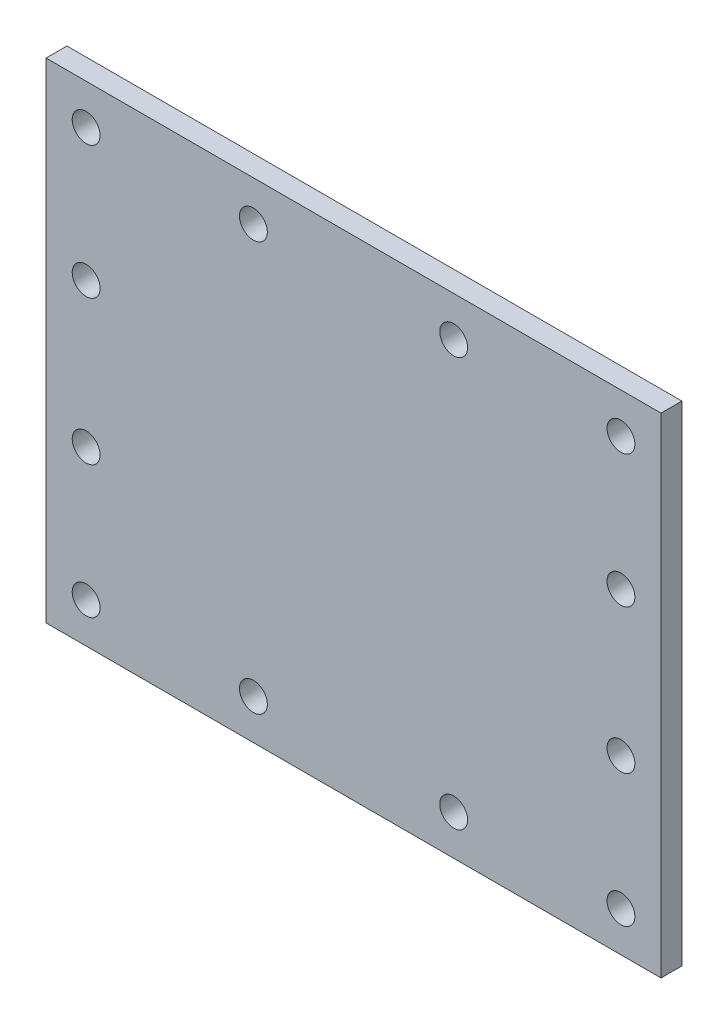
ISO-10303-21;
HEADER;
FILE_DESCRIPTION(('STEP AP214'),'2;1');
FILE_NAME('part.step','',(''),(''),'','','');
FILE_SCHEMA(('AUTOMOTIVE_DESIGN { 1 0 10303 214 1 1 1 1 }'));
ENDSEC;
DATA;
#1=APPLICATION_CONTEXT('core data for automotive mechanical design processes');
#2=APPLICATION_PROTOCOL_DEFINITION('international standard','automotive_design',2000,#1);
#3=PRODUCT_CONTEXT('',#1,'mechanical');
#4=PRODUCT('Part','Part','',(#3));
#5=PRODUCT_RELATED_PRODUCT_CATEGORY('part','',(#4));
#6=PRODUCT_DEFINITION_FORMATION('','',#4);
#7=PRODUCT_DEFINITION_CONTEXT('part definition',#1,'design');
#8=PRODUCT_DEFINITION('design','',#6,#7);
#9=PRODUCT_DEFINITION_SHAPE('','',#8);
#10=(LENGTH_UNIT() NAMED_UNIT(*) SI_UNIT(.MILLI.,.METRE.));
#11=(NAMED_UNIT(*) PLANE_ANGLE_UNIT() SI_UNIT($,.RADIAN.));
#12=(NAMED_UNIT(*) SI_UNIT($,.STERADIAN.) SOLID_ANGLE_UNIT());
#13=UNCERTAINTY_MEASURE_WITH_UNIT(LENGTH_MEASURE(1.E-05),#10,'distance_accuracy_value','');
#14=(GEOMETRIC_REPRESENTATION_CONTEXT(3) GLOBAL_UNCERTAINTY_ASSIGNED_CONTEXT((#13)) GLOBAL_UNIT_ASSIGNED_CONTEXT((#10,
#11,#12)) REPRESENTATION_CONTEXT('',''));
#15=CARTESIAN_POINT('',(0.,0.,0.));
#16=DIRECTION('',(0.,0.,1.));
#17=DIRECTION('',(1.,0.,0.));
#18=AXIS2_PLACEMENT_3D('',#15,#16,#17);
#19=CARTESIAN_POINT('',(-146.014312824647,106.091954424767,-2.51040500289528));
#20=DIRECTION('',(0.,1.,0.));
#21=DIRECTION('',(-1.,0.,0.));
#22=AXIS2_PLACEMENT_3D('',#19,#20,#21);
#23=PLANE('',#22);
#24=DIRECTION('',(1.,0.,0.));
#25=VECTOR('',#24,1.);
#26=CARTESIAN_POINT('',(-146.014312824647,106.091954424767,-5.51040500289528));
#27=LINE('',#26,#25);
#28=CARTESIAN_POINT('',(-146.014312824647,106.091954424767,-5.51040500289528));
#29=VERTEX_POINT('',#28);
#30=CARTESIAN_POINT('',(-57.7743128246472,106.091954424767,-5.51040500289528));
#31=VERTEX_POINT('',#30);
#32=EDGE_CURVE('E98',#29,#31,#27,.T.);
#33=ORIENTED_EDGE('',*,*,#32,.F.);
#34=DIRECTION('',(0.,0.,-1.));
#35=VECTOR('',#34,1.);
#36=CARTESIAN_POINT('',(-146.014312824647,106.091954424767,-2.51040500289528));
#37=LINE('',#36,#35);
#38=CARTESIAN_POINT('',(-146.014312824647,106.091954424767,-2.51040500289528));
#39=VERTEX_POINT('',#38);
#40=EDGE_CURVE('E11',#39,#29,#37,.T.);
#41=ORIENTED_EDGE('',*,*,#40,.F.);
#42=DIRECTION('',(1.,0.,0.));
#43=VECTOR('',#42,1.);
#44=CARTESIAN_POINT('',(-146.014312824647,106.091954424767,-2.51040500289528));
#45=LINE('',#44,#43);
#46=CARTESIAN_POINT('',(-57.7743128246472,106.091954424767,-2.51040500289528));
#47=VERTEX_POINT('',#46);
#48=EDGE_CURVE('E91',#39,#47,#45,.T.);
#49=ORIENTED_EDGE('',*,*,#48,.T.);
#50=DIRECTION('',(0.,0.,-1.));
#51=VECTOR('',#50,1.);
#52=CARTESIAN_POINT('',(-57.7743128246472,106.091954424767,-2.51040500289528));
#53=LINE('',#52,#51);
#54=EDGE_CURVE('E36',#47,#31,#53,.T.);
#55=ORIENTED_EDGE('',*,*,#54,.T.);
#56=EDGE_LOOP('',(#33,#41,#49,#55));
#57=FACE_BOUND('',#56,.T.);
#58=ADVANCED_FACE('F33',(#57),#23,.T.);
#59=CARTESIAN_POINT('',(-146.014312824647,35.8943544247679,-2.51040500289528));
#60=DIRECTION('',(-1.,0.,0.));
#61=DIRECTION('',(0.,0.,1.));
#62=AXIS2_PLACEMENT_3D('',#59,#60,#61);
#63=PLANE('',#62);
#64=DIRECTION('',(0.,1.,0.));
#65=VECTOR('',#64,1.);
#66=CARTESIAN_POINT('',(-146.014312824647,35.8943544247679,-5.51040500289528));
#67=LINE('',#66,#65);
#68=CARTESIAN_POINT('',(-146.014312824647,35.8943544247679,-5.51040500289528));
#69=VERTEX_POINT('',#68);
#70=EDGE_CURVE('E93',#69,#29,#67,.T.);
#71=ORIENTED_EDGE('',*,*,#70,.F.);
#72=DIRECTION('',(0.,0.,-1.));
#73=VECTOR('',#72,1.);
#74=CARTESIAN_POINT('',(-146.014312824647,35.8943544247679,-2.51040500289528));
#75=LINE('',#74,#73);
#76=CARTESIAN_POINT('',(-146.014312824647,35.8943544247679,-2.51040500289528));
#77=VERTEX_POINT('',#76);
#78=EDGE_CURVE('E42',#77,#69,#75,.T.);
#79=ORIENTED_EDGE('',*,*,#78,.F.);
#80=DIRECTION('',(0.,1.,0.));
#81=VECTOR('',#80,1.);
#82=CARTESIAN_POINT('',(-146.014312824647,35.8943544247679,-2.51040500289528));
#83=LINE('',#82,#81);
#84=EDGE_CURVE('E88',#77,#39,#83,.T.);
#85=ORIENTED_EDGE('',*,*,#84,.T.);
#86=ORIENTED_EDGE('',*,*,#40,.T.);
#87=EDGE_LOOP('',(#71,#79,#85,#86));
#88=FACE_BOUND('',#87,.T.);
#89=ADVANCED_FACE('F109',(#88),#63,.T.);
#90=CARTESIAN_POINT('',(-57.7743128246472,35.8943544247679,-2.51040500289528));
#91=DIRECTION('',(0.,-1.,0.));
#92=DIRECTION('',(1.,0.,0.));
#93=AXIS2_PLACEMENT_3D('',#90,#91,#92);
#94=PLANE('',#93);
#95=DIRECTION('',(-1.,0.,0.));
#96=VECTOR('',#95,1.);
#97=CARTESIAN_POINT('',(-57.7743128246472,35.8943544247679,-5.51040500289528));
#98=LINE('',#97,#96);
#99=CARTESIAN_POINT('',(-57.7743128246472,35.8943544247679,-5.51040500289528));
#100=VERTEX_POINT('',#99);
#101=EDGE_CURVE('E83',#100,#69,#98,.T.);
#102=ORIENTED_EDGE('',*,*,#101,.F.);
#103=DIRECTION('',(0.,0.,-1.));
#104=VECTOR('',#103,1.);
#105=CARTESIAN_POINT('',(-57.7743128246472,35.8943544247679,-2.51040500289528));
#106=LINE('',#105,#104);
#107=CARTESIAN_POINT('',(-57.7743128246472,35.8943544247679,-2.51040500289528));
#108=VERTEX_POINT('',#107);
#109=EDGE_CURVE('E78',#108,#100,#106,.T.);
#110=ORIENTED_EDGE('',*,*,#109,.F.);
#111=DIRECTION('',(-1.,0.,0.));
#112=VECTOR('',#111,1.);
#113=CARTESIAN_POINT('',(-57.7743128246472,35.8943544247679,-2.51040500289528));
#114=LINE('',#113,#112);
#115=EDGE_CURVE('E81',#108,#77,#114,.T.);
#116=ORIENTED_EDGE('',*,*,#115,.T.);
#117=ORIENTED_EDGE('',*,*,#78,.T.);
#118=EDGE_LOOP('',(#102,#110,#116,#117));
#119=FACE_BOUND('',#118,.T.);
#120=ADVANCED_FACE('F80',(#119),#94,.T.);
#121=CARTESIAN_POINT('',(-57.7743128246472,106.091954424767,-2.51040500289528));
#122=DIRECTION('',(1.,0.,0.));
#123=DIRECTION('',(0.,1.,0.));
#124=AXIS2_PLACEMENT_3D('',#121,#122,#123);
#125=PLANE('',#124);
#126=DIRECTION('',(0.,-1.,0.));
#127=VECTOR('',#126,1.);
#128=CARTESIAN_POINT('',(-57.7743128246472,106.091954424767,-5.51040500289528));
#129=LINE('',#128,#127);
#130=EDGE_CURVE('E101',#31,#100,#129,.T.);
#131=ORIENTED_EDGE('',*,*,#130,.F.);
#132=ORIENTED_EDGE('',*,*,#54,.F.);
#133=DIRECTION('',(0.,-1.,0.));
#134=VECTOR('',#133,1.);
#135=CARTESIAN_POINT('',(-57.7743128246472,106.091954424767,-2.51040500289528));
#136=LINE('',#135,#134);
#137=EDGE_CURVE('E87',#47,#108,#136,.T.);
#138=ORIENTED_EDGE('',*,*,#137,.T.);
#139=ORIENTED_EDGE('',*,*,#109,.T.);
#140=EDGE_LOOP('',(#131,#132,#138,#139));
#141=FACE_BOUND('',#140,.T.);
#142=ADVANCED_FACE('F90',(#141),#125,.T.);
#143=CARTESIAN_POINT('',(0.,0.,-2.51040500289528));
#144=DIRECTION('',(0.,0.,-1.));
#145=DIRECTION('',(-1.,0.,0.));
#146=AXIS2_PLACEMENT_3D('',#143,#144,#145);
#147=PLANE('',#146);
#148=CARTESIAN_POINT('',(-116.264312824647,100.341954424767,-2.51040500289528));
#149=DIRECTION('',(0.,0.,-1.));
#150=DIRECTION('',(-1.,0.,0.));
#151=AXIS2_PLACEMENT_3D('',#148,#149,#150);
#152=CIRCLE('',#151,2.);
#153=CARTESIAN_POINT('',(-118.264312824647,100.341954424767,-2.51040500289528));
#154=VERTEX_POINT('',#153);
#155=EDGE_CURVE('E182',#154,#154,#152,.T.);
#156=ORIENTED_EDGE('',*,*,#155,.T.);
#157=EDGE_LOOP('',(#156));
#158=FACE_BOUND('',#157,.T.);
#159=CARTESIAN_POINT('',(-87.5243128246472,100.341954424767,-2.51040500289528));
#160=DIRECTION('',(0.,0.,-1.));
#161=DIRECTION('',(-1.,0.,0.));
#162=AXIS2_PLACEMENT_3D('',#159,#160,#161);
#163=CIRCLE('',#162,2.);
#164=CARTESIAN_POINT('',(-89.5243128246472,100.341954424767,-2.51040500289528));
#165=VERTEX_POINT('',#164);
#166=EDGE_CURVE('E190',#165,#165,#163,.T.);
#167=ORIENTED_EDGE('',*,*,#166,.T.);
#168=EDGE_LOOP('',(#167));
#169=FACE_BOUND('',#168,.T.);
#170=CARTESIAN_POINT('',(-63.5243128246472,100.341954424767,-2.51040500289528));
#171=DIRECTION('',(0.,0.,-1.));
#172=DIRECTION('',(-1.,0.,0.));
#173=AXIS2_PLACEMENT_3D('',#170,#171,#172);
#174=CIRCLE('',#173,1.99999999999998);
#175=CARTESIAN_POINT('',(-65.5243128246472,100.341954424767,-2.51040500289528));
#176=VERTEX_POINT('',#175);
#177=EDGE_CURVE('E196',#176,#176,#174,.T.);
#178=ORIENTED_EDGE('',*,*,#177,.T.);
#179=EDGE_LOOP('',(#178));
#180=FACE_BOUND('',#179,.T.);
#181=CARTESIAN_POINT('',(-63.5243128246471,81.3419544247674,-2.51040500289528));
#182=DIRECTION('',(0.,0.,-1.));
#183=DIRECTION('',(-1.,0.,0.));
#184=AXIS2_PLACEMENT_3D('',#181,#182,#183);
#185=CIRCLE('',#184,1.99999999999998);
#186=CARTESIAN_POINT('',(-65.5243128246471,81.3419544247674,-2.51040500289528));
#187=VERTEX_POINT('',#186);
#188=EDGE_CURVE('E202',#187,#187,#185,.T.);
#189=ORIENTED_EDGE('',*,*,#188,.T.);
#190=EDGE_LOOP('',(#189));
#191=FACE_BOUND('',#190,.T.);
#192=CARTESIAN_POINT('',(-63.5243128246471,60.6443544247679,-2.51040500289528));
#193=DIRECTION('',(0.,0.,-1.));
#194=DIRECTION('',(-1.,0.,0.));
#195=AXIS2_PLACEMENT_3D('',#192,#193,#194);
#196=CIRCLE('',#195,1.99999999999998);
#197=CARTESIAN_POINT('',(-65.5243128246471,60.6443544247679,-2.51040500289528));
#198=VERTEX_POINT('',#197);
#199=EDGE_CURVE('E208',#198,#198,#196,.T.);
#200=ORIENTED_EDGE('',*,*,#199,.T.);
#201=EDGE_LOOP('',(#200));
#202=FACE_BOUND('',#201,.T.);
#203=CARTESIAN_POINT('',(-63.5243128246472,41.6443544247679,-2.51040500289528));
#204=DIRECTION('',(0.,0.,-1.));
#205=DIRECTION('',(-1.,0.,0.));
#206=AXIS2_PLACEMENT_3D('',#203,#204,#205);
#207=CIRCLE('',#206,1.99999999999998);
#208=CARTESIAN_POINT('',(-65.5243128246472,41.6443544247679,-2.51040500289528));
#209=VERTEX_POINT('',#208);
#210=EDGE_CURVE('E214',#209,#209,#207,.T.);
#211=ORIENTED_EDGE('',*,*,#210,.T.);
#212=EDGE_LOOP('',(#211));
#213=FACE_BOUND('',#212,.T.);
#214=CARTESIAN_POINT('',(-87.5243128246472,41.6443544247679,-2.51040500289528));
#215=DIRECTION('',(0.,0.,-1.));
#216=DIRECTION('',(-1.,0.,0.));
#217=AXIS2_PLACEMENT_3D('',#214,#215,#216);
#218=CIRCLE('',#217,2.);
#219=CARTESIAN_POINT('',(-89.5243128246472,41.6443544247679,-2.51040500289528));
#220=VERTEX_POINT('',#219);
#221=EDGE_CURVE('E220',#220,#220,#218,.T.);
#222=ORIENTED_EDGE('',*,*,#221,.T.);
#223=EDGE_LOOP('',(#222));
#224=FACE_BOUND('',#223,.T.);
#225=CARTESIAN_POINT('',(-116.264312824647,41.6443544247679,-2.51040500289528));
#226=DIRECTION('',(0.,0.,-1.));
#227=DIRECTION('',(-1.,0.,0.));
#228=AXIS2_PLACEMENT_3D('',#225,#226,#227);
#229=CIRCLE('',#228,2.);
#230=CARTESIAN_POINT('',(-118.264312824647,41.6443544247679,-2.51040500289528));
#231=VERTEX_POINT('',#230);
#232=EDGE_CURVE('E226',#231,#231,#229,.T.);
#233=ORIENTED_EDGE('',*,*,#232,.T.);
#234=EDGE_LOOP('',(#233));
#235=FACE_BOUND('',#234,.T.);
#236=CARTESIAN_POINT('',(-140.264312824647,41.6443544247679,-2.51040500289528));
#237=DIRECTION('',(0.,0.,-1.));
#238=DIRECTION('',(-1.,0.,0.));
#239=AXIS2_PLACEMENT_3D('',#236,#237,#238);
#240=CIRCLE('',#239,2.);
#241=CARTESIAN_POINT('',(-142.264312824647,41.6443544247679,-2.51040500289528));
#242=VERTEX_POINT('',#241);
#243=EDGE_CURVE('E232',#242,#242,#240,.T.);
#244=ORIENTED_EDGE('',*,*,#243,.T.);
#245=EDGE_LOOP('',(#244));
#246=FACE_BOUND('',#245,.T.);
#247=CARTESIAN_POINT('',(-140.264312824647,60.6443544247679,-2.51040500289528));
#248=DIRECTION('',(0.,0.,-1.));
#249=DIRECTION('',(-1.,0.,0.));
#250=AXIS2_PLACEMENT_3D('',#247,#248,#249);
#251=CIRCLE('',#250,2.);
#252=CARTESIAN_POINT('',(-142.264312824647,60.6443544247679,-2.51040500289528));
#253=VERTEX_POINT('',#252);
#254=EDGE_CURVE('E238',#253,#253,#251,.T.);
#255=ORIENTED_EDGE('',*,*,#254,.T.);
#256=EDGE_LOOP('',(#255));
#257=FACE_BOUND('',#256,.T.);
#258=CARTESIAN_POINT('',(-140.264312824647,100.341954424767,-2.51040500289528));
#259=DIRECTION('',(0.,0.,-1.));
#260=DIRECTION('',(-1.,0.,0.));
#261=AXIS2_PLACEMENT_3D('',#258,#259,#260);
#262=CIRCLE('',#261,2.);
#263=CARTESIAN_POINT('',(-142.264312824647,100.341954424767,-2.51040500289528));
#264=VERTEX_POINT('',#263);
#265=EDGE_CURVE('E244',#264,#264,#262,.T.);
#266=ORIENTED_EDGE('',*,*,#265,.T.);
#267=EDGE_LOOP('',(#266));
#268=FACE_BOUND('',#267,.T.);
#269=CARTESIAN_POINT('',(-140.264312824647,81.3419544247674,-2.51040500289528));
#270=DIRECTION('',(0.,0.,-1.));
#271=DIRECTION('',(-1.,0.,0.));
#272=AXIS2_PLACEMENT_3D('',#269,#270,#271);
#273=CIRCLE('',#272,2.);
#274=CARTESIAN_POINT('',(-142.264312824647,81.3419544247674,-2.51040500289528));
#275=VERTEX_POINT('',#274);
#276=EDGE_CURVE('E102',#275,#275,#273,.T.);
#277=ORIENTED_EDGE('',*,*,#276,.T.);
#278=EDGE_LOOP('',(#277));
#279=FACE_BOUND('',#278,.T.);
#280=ORIENTED_EDGE('',*,*,#48,.F.);
#281=ORIENTED_EDGE('',*,*,#84,.F.);
#282=ORIENTED_EDGE('',*,*,#115,.F.);
#283=ORIENTED_EDGE('',*,*,#137,.F.);
#284=EDGE_LOOP('',(#280,#281,#282,#283));
#285=FACE_BOUND('',#284,.T.);
#286=ADVANCED_FACE('F86',(#158,#169,#180,#191,#202,#213,#224,#235,#246,#257,#268,#279,#285),
#147,.F.);
#287=CARTESIAN_POINT('',(0.,0.,-5.51040500289528));
#288=DIRECTION('',(0.,0.,-1.));
#289=DIRECTION('',(-1.,0.,0.));
#290=AXIS2_PLACEMENT_3D('',#287,#288,#289);
#291=PLANE('',#290);
#292=CARTESIAN_POINT('',(-116.264312824647,100.341954424767,-5.51040500289528));
#293=DIRECTION('',(0.,0.,-1.));
#294=DIRECTION('',(-1.,0.,0.));
#295=AXIS2_PLACEMENT_3D('',#292,#293,#294);
#296=CIRCLE('',#295,2.);
#297=CARTESIAN_POINT('',(-118.264312824647,100.341954424767,-5.51040500289528));
#298=VERTEX_POINT('',#297);
#299=EDGE_CURVE('E185',#298,#298,#296,.T.);
#300=ORIENTED_EDGE('',*,*,#299,.F.);
#301=EDGE_LOOP('',(#300));
#302=FACE_BOUND('',#301,.T.);
#303=CARTESIAN_POINT('',(-87.5243128246472,100.341954424767,-5.51040500289528));
#304=DIRECTION('',(0.,0.,-1.));
#305=DIRECTION('',(-1.,0.,0.));
#306=AXIS2_PLACEMENT_3D('',#303,#304,#305);
#307=CIRCLE('',#306,2.);
#308=CARTESIAN_POINT('',(-89.5243128246472,100.341954424767,-5.51040500289528));
#309=VERTEX_POINT('',#308);
#310=EDGE_CURVE('E187',#309,#309,#307,.T.);
#311=ORIENTED_EDGE('',*,*,#310,.F.);
#312=EDGE_LOOP('',(#311));
#313=FACE_BOUND('',#312,.T.);
#314=CARTESIAN_POINT('',(-63.5243128246472,100.341954424767,-5.51040500289528));
#315=DIRECTION('',(0.,0.,-1.));
#316=DIRECTION('',(-1.,0.,0.));
#317=AXIS2_PLACEMENT_3D('',#314,#315,#316);
#318=CIRCLE('',#317,1.99999999999998);
#319=CARTESIAN_POINT('',(-65.5243128246472,100.341954424767,-5.51040500289528));
#320=VERTEX_POINT('',#319);
#321=EDGE_CURVE('E193',#320,#320,#318,.T.);
#322=ORIENTED_EDGE('',*,*,#321,.F.);
#323=EDGE_LOOP('',(#322));
#324=FACE_BOUND('',#323,.T.);
#325=CARTESIAN_POINT('',(-63.5243128246471,81.3419544247674,-5.51040500289528));
#326=DIRECTION('',(0.,0.,-1.));
#327=DIRECTION('',(-1.,0.,0.));
#328=AXIS2_PLACEMENT_3D('',#325,#326,#327);
#329=CIRCLE('',#328,1.99999999999998);
#330=CARTESIAN_POINT('',(-65.5243128246471,81.3419544247674,-5.51040500289528));
#331=VERTEX_POINT('',#330);
#332=EDGE_CURVE('E199',#331,#331,#329,.T.);
#333=ORIENTED_EDGE('',*,*,#332,.F.);
#334=EDGE_LOOP('',(#333));
#335=FACE_BOUND('',#334,.T.);
#336=CARTESIAN_POINT('',(-63.5243128246471,60.6443544247679,-5.51040500289528));
#337=DIRECTION('',(0.,0.,-1.));
#338=DIRECTION('',(-1.,0.,0.));
#339=AXIS2_PLACEMENT_3D('',#336,#337,#338);
#340=CIRCLE('',#339,1.99999999999998);
#341=CARTESIAN_POINT('',(-65.5243128246471,60.6443544247679,-5.51040500289528));
#342=VERTEX_POINT('',#341);
#343=EDGE_CURVE('E205',#342,#342,#340,.T.);
#344=ORIENTED_EDGE('',*,*,#343,.F.);
#345=EDGE_LOOP('',(#344));
#346=FACE_BOUND('',#345,.T.);
#347=CARTESIAN_POINT('',(-63.5243128246472,41.6443544247679,-5.51040500289528));
#348=DIRECTION('',(0.,0.,-1.));
#349=DIRECTION('',(-1.,0.,0.));
#350=AXIS2_PLACEMENT_3D('',#347,#348,#349);
#351=CIRCLE('',#350,1.99999999999998);
#352=CARTESIAN_POINT('',(-65.5243128246472,41.6443544247679,-5.51040500289528));
#353=VERTEX_POINT('',#352);
#354=EDGE_CURVE('E211',#353,#353,#351,.T.);
#355=ORIENTED_EDGE('',*,*,#354,.F.);
#356=EDGE_LOOP('',(#355));
#357=FACE_BOUND('',#356,.T.);
#358=CARTESIAN_POINT('',(-87.5243128246472,41.6443544247679,-5.51040500289528));
#359=DIRECTION('',(0.,0.,-1.));
#360=DIRECTION('',(-1.,0.,0.));
#361=AXIS2_PLACEMENT_3D('',#358,#359,#360);
#362=CIRCLE('',#361,2.);
#363=CARTESIAN_POINT('',(-89.5243128246472,41.6443544247679,-5.51040500289528));
#364=VERTEX_POINT('',#363);
#365=EDGE_CURVE('E217',#364,#364,#362,.T.);
#366=ORIENTED_EDGE('',*,*,#365,.F.);
#367=EDGE_LOOP('',(#366));
#368=FACE_BOUND('',#367,.T.);
#369=CARTESIAN_POINT('',(-116.264312824647,41.6443544247679,-5.51040500289528));
#370=DIRECTION('',(0.,0.,-1.));
#371=DIRECTION('',(-1.,0.,0.));
#372=AXIS2_PLACEMENT_3D('',#369,#370,#371);
#373=CIRCLE('',#372,2.);
#374=CARTESIAN_POINT('',(-118.264312824647,41.6443544247679,-5.51040500289528));
#375=VERTEX_POINT('',#374);
#376=EDGE_CURVE('E223',#375,#375,#373,.T.);
#377=ORIENTED_EDGE('',*,*,#376,.F.);
#378=EDGE_LOOP('',(#377));
#379=FACE_BOUND('',#378,.T.);
#380=CARTESIAN_POINT('',(-140.264312824647,41.6443544247679,-5.51040500289528));
#381=DIRECTION('',(0.,0.,-1.));
#382=DIRECTION('',(-1.,0.,0.));
#383=AXIS2_PLACEMENT_3D('',#380,#381,#382);
#384=CIRCLE('',#383,2.);
#385=CARTESIAN_POINT('',(-142.264312824647,41.6443544247679,-5.51040500289528));
#386=VERTEX_POINT('',#385);
#387=EDGE_CURVE('E229',#386,#386,#384,.T.);
#388=ORIENTED_EDGE('',*,*,#387,.F.);
#389=EDGE_LOOP('',(#388));
#390=FACE_BOUND('',#389,.T.);
#391=CARTESIAN_POINT('',(-140.264312824647,60.6443544247679,-5.51040500289528));
#392=DIRECTION('',(0.,0.,-1.));
#393=DIRECTION('',(-1.,0.,0.));
#394=AXIS2_PLACEMENT_3D('',#391,#392,#393);
#395=CIRCLE('',#394,2.);
#396=CARTESIAN_POINT('',(-142.264312824647,60.6443544247679,-5.51040500289528));
#397=VERTEX_POINT('',#396);
#398=EDGE_CURVE('E235',#397,#397,#395,.T.);
#399=ORIENTED_EDGE('',*,*,#398,.F.);
#400=EDGE_LOOP('',(#399));
#401=FACE_BOUND('',#400,.T.);
#402=CARTESIAN_POINT('',(-140.264312824647,100.341954424767,-5.51040500289528));
#403=DIRECTION('',(0.,0.,-1.));
#404=DIRECTION('',(-1.,0.,0.));
#405=AXIS2_PLACEMENT_3D('',#402,#403,#404);
#406=CIRCLE('',#405,2.);
#407=CARTESIAN_POINT('',(-142.264312824647,100.341954424767,-5.51040500289528));
#408=VERTEX_POINT('',#407);
#409=EDGE_CURVE('E241',#408,#408,#406,.T.);
#410=ORIENTED_EDGE('',*,*,#409,.F.);
#411=EDGE_LOOP('',(#410));
#412=FACE_BOUND('',#411,.T.);
#413=CARTESIAN_POINT('',(-140.264312824647,81.3419544247674,-5.51040500289528));
#414=DIRECTION('',(0.,0.,-1.));
#415=DIRECTION('',(-1.,0.,0.));
#416=AXIS2_PLACEMENT_3D('',#413,#414,#415);
#417=CIRCLE('',#416,2.);
#418=CARTESIAN_POINT('',(-142.264312824647,81.3419544247674,-5.51040500289528));
#419=VERTEX_POINT('',#418);
#420=EDGE_CURVE('E247',#419,#419,#417,.T.);
#421=ORIENTED_EDGE('',*,*,#420,.F.);
#422=EDGE_LOOP('',(#421));
#423=FACE_BOUND('',#422,.T.);
#424=ORIENTED_EDGE('',*,*,#32,.T.);
#425=ORIENTED_EDGE('',*,*,#130,.T.);
#426=ORIENTED_EDGE('',*,*,#101,.T.);
#427=ORIENTED_EDGE('',*,*,#70,.T.);
#428=EDGE_LOOP('',(#424,#425,#426,#427));
#429=FACE_BOUND('',#428,.T.);
#430=ADVANCED_FACE('F108',(#302,#313,#324,#335,#346,#357,#368,#379,#390,#401,#412,#423,#429),
#291,.T.);
#431=CARTESIAN_POINT('',(-140.264312824647,81.3419544247674,-2.51040500289528));
#432=DIRECTION('',(0.,0.,-1.));
#433=DIRECTION('',(-1.,0.,0.));
#434=AXIS2_PLACEMENT_3D('',#431,#432,#433);
#435=CYLINDRICAL_SURFACE('',#434,2.);
#436=ORIENTED_EDGE('',*,*,#276,.F.);
#437=EDGE_LOOP('',(#436));
#438=FACE_BOUND('',#437,.T.);
#439=ORIENTED_EDGE('',*,*,#420,.T.);
#440=EDGE_LOOP('',(#439));
#441=FACE_BOUND('',#440,.T.);
#442=ADVANCED_FACE('F127',(#438,#441),#435,.F.);
#443=CARTESIAN_POINT('',(-140.264312824647,100.341954424767,-2.51040500289528));
#444=DIRECTION('',(0.,0.,-1.));
#445=DIRECTION('',(-1.,0.,0.));
#446=AXIS2_PLACEMENT_3D('',#443,#444,#445);
#447=CYLINDRICAL_SURFACE('',#446,2.);
#448=ORIENTED_EDGE('',*,*,#265,.F.);
#449=EDGE_LOOP('',(#448));
#450=FACE_BOUND('',#449,.T.);
#451=ORIENTED_EDGE('',*,*,#409,.T.);
#452=EDGE_LOOP('',(#451));
#453=FACE_BOUND('',#452,.T.);
#454=ADVANCED_FACE('F134',(#450,#453),#447,.F.);
#455=CARTESIAN_POINT('',(-140.264312824647,60.6443544247679,-2.51040500289528));
#456=DIRECTION('',(0.,0.,-1.));
#457=DIRECTION('',(-1.,0.,0.));
#458=AXIS2_PLACEMENT_3D('',#455,#456,#457);
#459=CYLINDRICAL_SURFACE('',#458,2.);
#460=ORIENTED_EDGE('',*,*,#254,.F.);
#461=EDGE_LOOP('',(#460));
#462=FACE_BOUND('',#461,.T.);
#463=ORIENTED_EDGE('',*,*,#398,.T.);
#464=EDGE_LOOP('',(#463));
#465=FACE_BOUND('',#464,.T.);
#466=ADVANCED_FACE('F138',(#462,#465),#459,.F.);
#467=CARTESIAN_POINT('',(-140.264312824647,41.6443544247679,-2.51040500289528));
#468=DIRECTION('',(0.,0.,-1.));
#469=DIRECTION('',(-1.,0.,0.));
#470=AXIS2_PLACEMENT_3D('',#467,#468,#469);
#471=CYLINDRICAL_SURFACE('',#470,2.);
#472=ORIENTED_EDGE('',*,*,#243,.F.);
#473=EDGE_LOOP('',(#472));
#474=FACE_BOUND('',#473,.T.);
#475=ORIENTED_EDGE('',*,*,#387,.T.);
#476=EDGE_LOOP('',(#475));
#477=FACE_BOUND('',#476,.T.);
#478=ADVANCED_FACE('F142',(#474,#477),#471,.F.);
#479=CARTESIAN_POINT('',(-116.264312824647,41.6443544247679,-2.51040500289528));
#480=DIRECTION('',(0.,0.,-1.));
#481=DIRECTION('',(-1.,0.,0.));
#482=AXIS2_PLACEMENT_3D('',#479,#480,#481);
#483=CYLINDRICAL_SURFACE('',#482,2.);
#484=ORIENTED_EDGE('',*,*,#232,.F.);
#485=EDGE_LOOP('',(#484));
#486=FACE_BOUND('',#485,.T.);
#487=ORIENTED_EDGE('',*,*,#376,.T.);
#488=EDGE_LOOP('',(#487));
#489=FACE_BOUND('',#488,.T.);
#490=ADVANCED_FACE('F146',(#486,#489),#483,.F.);
#491=CARTESIAN_POINT('',(-87.5243128246472,41.6443544247679,-2.51040500289528));
#492=DIRECTION('',(0.,0.,-1.));
#493=DIRECTION('',(-1.,0.,0.));
#494=AXIS2_PLACEMENT_3D('',#491,#492,#493);
#495=CYLINDRICAL_SURFACE('',#494,2.);
#496=ORIENTED_EDGE('',*,*,#221,.F.);
#497=EDGE_LOOP('',(#496));
#498=FACE_BOUND('',#497,.T.);
#499=ORIENTED_EDGE('',*,*,#365,.T.);
#500=EDGE_LOOP('',(#499));
#501=FACE_BOUND('',#500,.T.);
#502=ADVANCED_FACE('F150',(#498,#501),#495,.F.);
#503=CARTESIAN_POINT('',(-63.5243128246472,41.6443544247679,-2.51040500289528));
#504=DIRECTION('',(0.,0.,-1.));
#505=DIRECTION('',(-1.,0.,0.));
#506=AXIS2_PLACEMENT_3D('',#503,#504,#505);
#507=CYLINDRICAL_SURFACE('',#506,1.99999999999998);
#508=ORIENTED_EDGE('',*,*,#210,.F.);
#509=EDGE_LOOP('',(#508));
#510=FACE_BOUND('',#509,.T.);
#511=ORIENTED_EDGE('',*,*,#354,.T.);
#512=EDGE_LOOP('',(#511));
#513=FACE_BOUND('',#512,.T.);
#514=ADVANCED_FACE('F154',(#510,#513),#507,.F.);
#515=CARTESIAN_POINT('',(-63.5243128246471,60.6443544247679,-2.51040500289528));
#516=DIRECTION('',(0.,0.,-1.));
#517=DIRECTION('',(-1.,0.,0.));
#518=AXIS2_PLACEMENT_3D('',#515,#516,#517);
#519=CYLINDRICAL_SURFACE('',#518,1.99999999999998);
#520=ORIENTED_EDGE('',*,*,#199,.F.);
#521=EDGE_LOOP('',(#520));
#522=FACE_BOUND('',#521,.T.);
#523=ORIENTED_EDGE('',*,*,#343,.T.);
#524=EDGE_LOOP('',(#523));
#525=FACE_BOUND('',#524,.T.);
#526=ADVANCED_FACE('F158',(#522,#525),#519,.F.);
#527=CARTESIAN_POINT('',(-63.5243128246471,81.3419544247674,-2.51040500289528));
#528=DIRECTION('',(0.,0.,-1.));
#529=DIRECTION('',(-1.,0.,0.));
#530=AXIS2_PLACEMENT_3D('',#527,#528,#529);
#531=CYLINDRICAL_SURFACE('',#530,1.99999999999998);
#532=ORIENTED_EDGE('',*,*,#188,.F.);
#533=EDGE_LOOP('',(#532));
#534=FACE_BOUND('',#533,.T.);
#535=ORIENTED_EDGE('',*,*,#332,.T.);
#536=EDGE_LOOP('',(#535));
#537=FACE_BOUND('',#536,.T.);
#538=ADVANCED_FACE('F162',(#534,#537),#531,.F.);
#539=CARTESIAN_POINT('',(-63.5243128246472,100.341954424767,-2.51040500289528));
#540=DIRECTION('',(0.,0.,-1.));
#541=DIRECTION('',(-1.,0.,0.));
#542=AXIS2_PLACEMENT_3D('',#539,#540,#541);
#543=CYLINDRICAL_SURFACE('',#542,1.99999999999998);
#544=ORIENTED_EDGE('',*,*,#177,.F.);
#545=EDGE_LOOP('',(#544));
#546=FACE_BOUND('',#545,.T.);
#547=ORIENTED_EDGE('',*,*,#321,.T.);
#548=EDGE_LOOP('',(#547));
#549=FACE_BOUND('',#548,.T.);
#550=ADVANCED_FACE('F166',(#546,#549),#543,.F.);
#551=CARTESIAN_POINT('',(-87.5243128246472,100.341954424767,-2.51040500289528));
#552=DIRECTION('',(0.,0.,-1.));
#553=DIRECTION('',(-1.,0.,0.));
#554=AXIS2_PLACEMENT_3D('',#551,#552,#553);
#555=CYLINDRICAL_SURFACE('',#554,2.);
#556=ORIENTED_EDGE('',*,*,#166,.F.);
#557=EDGE_LOOP('',(#556));
#558=FACE_BOUND('',#557,.T.);
#559=ORIENTED_EDGE('',*,*,#310,.T.);
#560=EDGE_LOOP('',(#559));
#561=FACE_BOUND('',#560,.T.);
#562=ADVANCED_FACE('F170',(#558,#561),#555,.F.);
#563=CARTESIAN_POINT('',(-116.264312824647,100.341954424767,-2.51040500289528));
#564=DIRECTION('',(0.,0.,-1.));
#565=DIRECTION('',(-1.,0.,0.));
#566=AXIS2_PLACEMENT_3D('',#563,#564,#565);
#567=CYLINDRICAL_SURFACE('',#566,2.);
#568=ORIENTED_EDGE('',*,*,#155,.F.);
#569=EDGE_LOOP('',(#568));
#570=FACE_BOUND('',#569,.T.);
#571=ORIENTED_EDGE('',*,*,#299,.T.);
#572=EDGE_LOOP('',(#571));
#573=FACE_BOUND('',#572,.T.);
#574=ADVANCED_FACE('F174',(#570,#573),#567,.F.);
#575=CLOSED_SHELL('',(#58,#89,#120,#142,#286,#430,#442,#454,#466,#478,#490,#502,#514,#526,#538,
#550,#562,#574));
#576=MANIFOLD_SOLID_BREP('B2',#575);
#577=ADVANCED_BREP_SHAPE_REPRESENTATION('',(#18,#576),#14);
#578=SHAPE_DEFINITION_REPRESENTATION(#9,#577);
ENDSEC;
END-ISO-10303-21;
